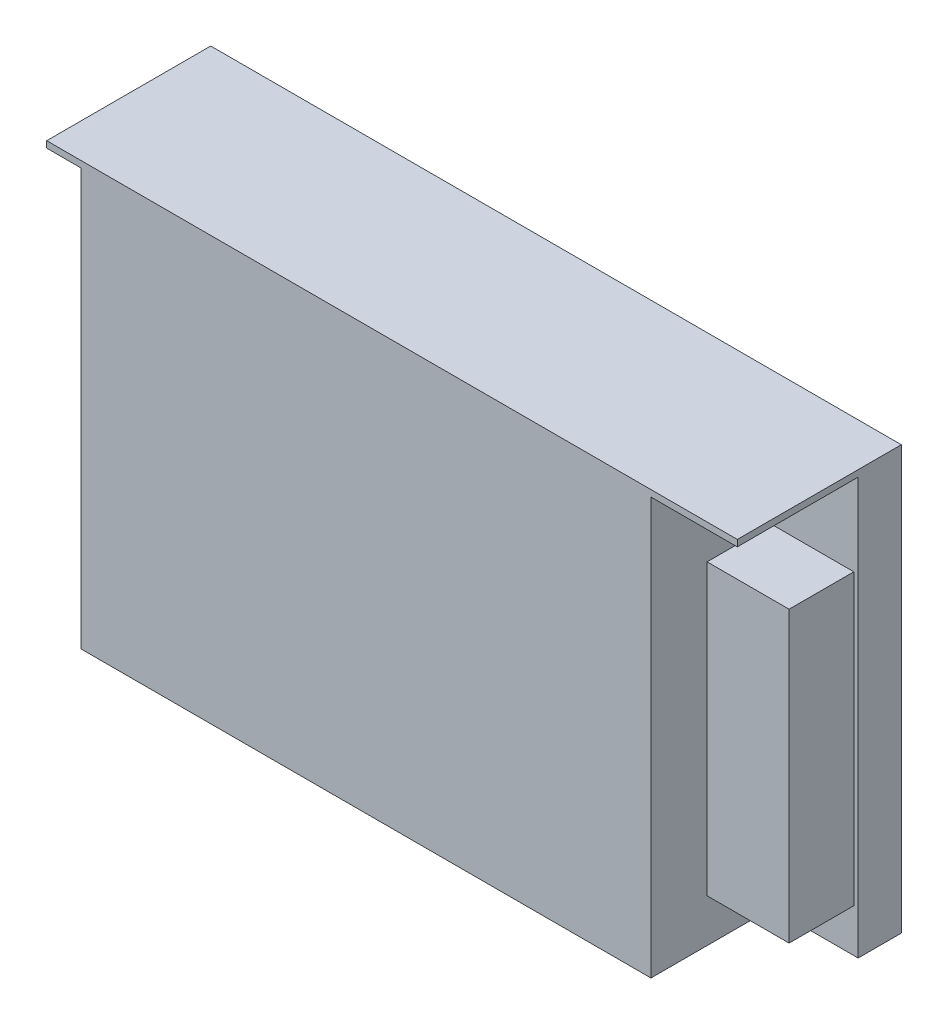
ISO-10303-21;
HEADER;
FILE_DESCRIPTION(('STEP AP214'),'2;1');
FILE_NAME('part.step','',(''),(''),'','','');
FILE_SCHEMA(('AUTOMOTIVE_DESIGN { 1 0 10303 214 1 1 1 1 }'));
ENDSEC;
DATA;
#1=APPLICATION_CONTEXT('core data for automotive mechanical design processes');
#2=APPLICATION_PROTOCOL_DEFINITION('international standard','automotive_design',2000,#1);
#3=PRODUCT_CONTEXT('',#1,'mechanical');
#4=PRODUCT('Part','Part','',(#3));
#5=PRODUCT_RELATED_PRODUCT_CATEGORY('part','',(#4));
#6=PRODUCT_DEFINITION_FORMATION('','',#4);
#7=PRODUCT_DEFINITION_CONTEXT('part definition',#1,'design');
#8=PRODUCT_DEFINITION('design','',#6,#7);
#9=PRODUCT_DEFINITION_SHAPE('','',#8);
#10=(LENGTH_UNIT() NAMED_UNIT(*) SI_UNIT(.MILLI.,.METRE.));
#11=(NAMED_UNIT(*) PLANE_ANGLE_UNIT() SI_UNIT($,.RADIAN.));
#12=(NAMED_UNIT(*) SI_UNIT($,.STERADIAN.) SOLID_ANGLE_UNIT());
#13=UNCERTAINTY_MEASURE_WITH_UNIT(LENGTH_MEASURE(1.E-05),#10,'distance_accuracy_value','');
#14=(GEOMETRIC_REPRESENTATION_CONTEXT(3) GLOBAL_UNCERTAINTY_ASSIGNED_CONTEXT((#13)) GLOBAL_UNIT_ASSIGNED_CONTEXT((#10,
#11,#12)) REPRESENTATION_CONTEXT('',''));
#15=CARTESIAN_POINT('',(0.,0.,0.));
#16=DIRECTION('',(0.,0.,1.));
#17=DIRECTION('',(1.,0.,0.));
#18=AXIS2_PLACEMENT_3D('',#15,#16,#17);
#19=CARTESIAN_POINT('',(8.,0.,30.0000000000001));
#20=DIRECTION('',(0.70710678118655,0.,-0.707106781186545));
#21=DIRECTION('',(0.,-1.,0.));
#22=AXIS2_PLACEMENT_3D('',#19,#20,#21);
#23=PLANE('',#22);
#24=DIRECTION('',(-0.707106781186545,0.,-0.70710678118655));
#25=VECTOR('',#24,1.);
#26=CARTESIAN_POINT('',(0.,10.,22.));
#27=LINE('',#26,#25);
#28=CARTESIAN_POINT('',(8.,10.,30.0000000000001));
#29=VERTEX_POINT('',#28);
#30=CARTESIAN_POINT('',(0.,10.,22.));
#31=VERTEX_POINT('',#30);
#32=EDGE_CURVE('E159',#29,#31,#27,.T.);
#33=ORIENTED_EDGE('',*,*,#32,.F.);
#34=DIRECTION('',(0.,-1.,0.));
#35=VECTOR('',#34,1.);
#36=CARTESIAN_POINT('',(8.,0.,30.0000000000001));
#37=LINE('',#36,#35);
#38=CARTESIAN_POINT('',(8.,96.5,30.0000000000001));
#39=VERTEX_POINT('',#38);
#40=EDGE_CURVE('E44',#39,#29,#37,.T.);
#41=ORIENTED_EDGE('',*,*,#40,.F.);
#42=DIRECTION('',(0.707106781186545,0.,0.70710678118655));
#43=VECTOR('',#42,1.);
#44=CARTESIAN_POINT('',(8.,96.5,30.0000000000001));
#45=LINE('',#44,#43);
#46=CARTESIAN_POINT('',(0.,96.5,22.));
#47=VERTEX_POINT('',#46);
#48=EDGE_CURVE('E11',#47,#39,#45,.T.);
#49=ORIENTED_EDGE('',*,*,#48,.F.);
#50=DIRECTION('',(0.,-1.,0.));
#51=VECTOR('',#50,1.);
#52=CARTESIAN_POINT('',(0.,0.,22.));
#53=LINE('',#52,#51);
#54=EDGE_CURVE('E179',#47,#31,#53,.T.);
#55=ORIENTED_EDGE('',*,*,#54,.T.);
#56=EDGE_LOOP('',(#33,#41,#49,#55));
#57=FACE_BOUND('',#56,.T.);
#58=ADVANCED_FACE('F37',(#57),#23,.F.);
#59=CARTESIAN_POINT('',(140.,96.5,10.));
#60=DIRECTION('',(-1.,0.,0.));
#61=DIRECTION('',(0.,0.,1.));
#62=AXIS2_PLACEMENT_3D('',#59,#60,#61);
#63=PLANE('',#62);
#64=DIRECTION('',(0.,0.,-1.));
#65=VECTOR('',#64,1.);
#66=CARTESIAN_POINT('',(140.,9.99999999999999,25.));
#67=LINE('',#66,#65);
#68=CARTESIAN_POINT('',(140.,9.99999999999999,25.));
#69=VERTEX_POINT('',#68);
#70=CARTESIAN_POINT('',(140.,9.99999999999999,10.));
#71=VERTEX_POINT('',#70);
#72=EDGE_CURVE('E215',#69,#71,#67,.T.);
#73=ORIENTED_EDGE('',*,*,#72,.F.);
#74=DIRECTION('',(0.,-1.,0.));
#75=VECTOR('',#74,1.);
#76=CARTESIAN_POINT('',(140.,9.99999999999999,25.));
#77=LINE('',#76,#75);
#78=CARTESIAN_POINT('',(140.,77.,25.));
#79=VERTEX_POINT('',#78);
#80=EDGE_CURVE('E188',#79,#69,#77,.T.);
#81=ORIENTED_EDGE('',*,*,#80,.F.);
#82=DIRECTION('',(0.,0.,-1.));
#83=VECTOR('',#82,1.);
#84=CARTESIAN_POINT('',(140.,77.,25.));
#85=LINE('',#84,#83);
#86=CARTESIAN_POINT('',(140.,77.,10.));
#87=VERTEX_POINT('',#86);
#88=EDGE_CURVE('E199',#79,#87,#85,.T.);
#89=ORIENTED_EDGE('',*,*,#88,.T.);
#90=DIRECTION('',(0.,-1.,0.));
#91=VECTOR('',#90,1.);
#92=CARTESIAN_POINT('',(140.,96.5,10.));
#93=LINE('',#92,#91);
#94=CARTESIAN_POINT('',(140.,96.5,10.));
#95=VERTEX_POINT('',#94);
#96=EDGE_CURVE('E227',#95,#87,#93,.T.);
#97=ORIENTED_EDGE('',*,*,#96,.F.);
#98=DIRECTION('',(0.,0.,1.));
#99=VECTOR('',#98,1.);
#100=CARTESIAN_POINT('',(140.,96.5,10.));
#101=LINE('',#100,#99);
#102=CARTESIAN_POINT('',(140.,96.5,38.));
#103=VERTEX_POINT('',#102);
#104=EDGE_CURVE('E240',#95,#103,#101,.T.);
#105=ORIENTED_EDGE('',*,*,#104,.T.);
#106=DIRECTION('',(0.,-1.,0.));
#107=VECTOR('',#106,1.);
#108=CARTESIAN_POINT('',(140.,96.5,38.));
#109=LINE('',#108,#107);
#110=CARTESIAN_POINT('',(140.,0.,38.));
#111=VERTEX_POINT('',#110);
#112=EDGE_CURVE('E223',#103,#111,#109,.T.);
#113=ORIENTED_EDGE('',*,*,#112,.T.);
#114=DIRECTION('',(0.,0.,1.));
#115=VECTOR('',#114,1.);
#116=CARTESIAN_POINT('',(140.,0.,10.));
#117=LINE('',#116,#115);
#118=CARTESIAN_POINT('',(140.,0.,10.));
#119=VERTEX_POINT('',#118);
#120=EDGE_CURVE('E236',#119,#111,#117,.T.);
#121=ORIENTED_EDGE('',*,*,#120,.F.);
#122=EDGE_CURVE('E226',#71,#119,#93,.T.);
#123=ORIENTED_EDGE('',*,*,#122,.F.);
#124=EDGE_LOOP('',(#73,#81,#89,#97,#105,#113,#121,#123));
#125=FACE_BOUND('',#124,.T.);
#126=ADVANCED_FACE('F301',(#125),#63,.F.);
#127=CARTESIAN_POINT('',(0.,0.,10.));
#128=DIRECTION('',(0.,0.,-1.));
#129=DIRECTION('',(-1.,0.,0.));
#130=AXIS2_PLACEMENT_3D('',#127,#128,#129);
#131=PLANE('',#130);
#132=DIRECTION('',(1.,0.,0.));
#133=VECTOR('',#132,1.);
#134=CARTESIAN_POINT('',(140.,9.99999999999999,10.));
#135=LINE('',#134,#133);
#136=CARTESIAN_POINT('',(159.,10.,10.));
#137=VERTEX_POINT('',#136);
#138=EDGE_CURVE('E187',#71,#137,#135,.T.);
#139=ORIENTED_EDGE('',*,*,#138,.F.);
#140=ORIENTED_EDGE('',*,*,#122,.T.);
#141=DIRECTION('',(1.,0.,0.));
#142=VECTOR('',#141,1.);
#143=CARTESIAN_POINT('',(160.,0.,10.));
#144=LINE('',#143,#142);
#145=CARTESIAN_POINT('',(160.,0.,10.));
#146=VERTEX_POINT('',#145);
#147=EDGE_CURVE('E229',#119,#146,#144,.T.);
#148=ORIENTED_EDGE('',*,*,#147,.T.);
#149=DIRECTION('',(0.,1.,0.));
#150=VECTOR('',#149,1.);
#151=CARTESIAN_POINT('',(160.,96.5,10.));
#152=LINE('',#151,#150);
#153=CARTESIAN_POINT('',(160.,96.5,10.));
#154=VERTEX_POINT('',#153);
#155=EDGE_CURVE('E219',#146,#154,#152,.T.);
#156=ORIENTED_EDGE('',*,*,#155,.T.);
#157=DIRECTION('',(-1.,0.,0.));
#158=VECTOR('',#157,1.);
#159=CARTESIAN_POINT('',(160.,96.5,10.));
#160=LINE('',#159,#158);
#161=EDGE_CURVE('E222',#154,#95,#160,.T.);
#162=ORIENTED_EDGE('',*,*,#161,.T.);
#163=ORIENTED_EDGE('',*,*,#96,.T.);
#164=DIRECTION('',(-1.,0.,0.));
#165=VECTOR('',#164,1.);
#166=CARTESIAN_POINT('',(140.,77.,10.));
#167=LINE('',#166,#165);
#168=CARTESIAN_POINT('',(159.,77.,10.));
#169=VERTEX_POINT('',#168);
#170=EDGE_CURVE('E192',#169,#87,#167,.T.);
#171=ORIENTED_EDGE('',*,*,#170,.F.);
#172=DIRECTION('',(0.,1.,0.));
#173=VECTOR('',#172,1.);
#174=CARTESIAN_POINT('',(159.,10.,10.));
#175=LINE('',#174,#173);
#176=EDGE_CURVE('E202',#137,#169,#175,.T.);
#177=ORIENTED_EDGE('',*,*,#176,.F.);
#178=EDGE_LOOP('',(#139,#140,#148,#156,#162,#163,#171,#177));
#179=FACE_BOUND('',#178,.T.);
#180=ADVANCED_FACE('F306',(#179),#131,.F.);
#181=CARTESIAN_POINT('',(0.,0.,38.));
#182=DIRECTION('',(1.,0.,0.));
#183=DIRECTION('',(0.,0.,-1.));
#184=AXIS2_PLACEMENT_3D('',#181,#182,#183);
#185=PLANE('',#184);
#186=DIRECTION('',(0.,0.,-1.));
#187=VECTOR('',#186,1.);
#188=CARTESIAN_POINT('',(0.,0.,38.));
#189=LINE('',#188,#187);
#190=CARTESIAN_POINT('',(0.,0.,1.5));
#191=VERTEX_POINT('',#190);
#192=CARTESIAN_POINT('',(0.,0.,0.));
#193=VERTEX_POINT('',#192);
#194=EDGE_CURVE('E168',#191,#193,#189,.T.);
#195=ORIENTED_EDGE('',*,*,#194,.F.);
#196=DIRECTION('',(0.,-1.,0.));
#197=VECTOR('',#196,1.);
#198=CARTESIAN_POINT('',(0.,10.,1.5));
#199=LINE('',#198,#197);
#200=CARTESIAN_POINT('',(0.,10.,1.5));
#201=VERTEX_POINT('',#200);
#202=EDGE_CURVE('E151',#201,#191,#199,.T.);
#203=ORIENTED_EDGE('',*,*,#202,.F.);
#204=DIRECTION('',(0.,0.,-1.));
#205=VECTOR('',#204,1.);
#206=CARTESIAN_POINT('',(0.,10.,1.5));
#207=LINE('',#206,#205);
#208=EDGE_CURVE('E155',#31,#201,#207,.T.);
#209=ORIENTED_EDGE('',*,*,#208,.F.);
#210=ORIENTED_EDGE('',*,*,#54,.F.);
#211=DIRECTION('',(0.,0.,-1.));
#212=VECTOR('',#211,1.);
#213=CARTESIAN_POINT('',(0.,96.5,38.));
#214=LINE('',#213,#212);
#215=CARTESIAN_POINT('',(0.,96.5,38.));
#216=VERTEX_POINT('',#215);
#217=EDGE_CURVE('E170',#216,#47,#214,.T.);
#218=ORIENTED_EDGE('',*,*,#217,.F.);
#219=DIRECTION('',(0.,-1.,0.));
#220=VECTOR('',#219,1.);
#221=CARTESIAN_POINT('',(0.,0.,38.));
#222=LINE('',#221,#220);
#223=CARTESIAN_POINT('',(0.,98.,38.));
#224=VERTEX_POINT('',#223);
#225=EDGE_CURVE('E243',#224,#216,#222,.T.);
#226=ORIENTED_EDGE('',*,*,#225,.F.);
#227=DIRECTION('',(0.,0.,-1.));
#228=VECTOR('',#227,1.);
#229=CARTESIAN_POINT('',(0.,98.,38.));
#230=LINE('',#229,#228);
#231=CARTESIAN_POINT('',(0.,98.,0.));
#232=VERTEX_POINT('',#231);
#233=EDGE_CURVE('E253',#224,#232,#230,.T.);
#234=ORIENTED_EDGE('',*,*,#233,.T.);
#235=DIRECTION('',(0.,-1.,0.));
#236=VECTOR('',#235,1.);
#237=CARTESIAN_POINT('',(0.,0.,0.));
#238=LINE('',#237,#236);
#239=EDGE_CURVE('E239',#232,#193,#238,.T.);
#240=ORIENTED_EDGE('',*,*,#239,.T.);
#241=EDGE_LOOP('',(#195,#203,#209,#210,#218,#226,#234,#240));
#242=FACE_BOUND('',#241,.T.);
#243=ADVANCED_FACE('F166',(#242),#185,.F.);
#244=CARTESIAN_POINT('',(0.,0.,38.));
#245=DIRECTION('',(0.,1.,0.));
#246=DIRECTION('',(0.,0.,1.));
#247=AXIS2_PLACEMENT_3D('',#244,#245,#246);
#248=PLANE('',#247);
#249=DIRECTION('',(0.,0.,1.));
#250=VECTOR('',#249,1.);
#251=CARTESIAN_POINT('',(8.,0.,38.));
#252=LINE('',#251,#250);
#253=CARTESIAN_POINT('',(8.,0.,1.5));
#254=VERTEX_POINT('',#253);
#255=CARTESIAN_POINT('',(8.,0.,38.));
#256=VERTEX_POINT('',#255);
#257=EDGE_CURVE('E181',#254,#256,#252,.T.);
#258=ORIENTED_EDGE('',*,*,#257,.F.);
#259=DIRECTION('',(1.,0.,0.));
#260=VECTOR('',#259,1.);
#261=CARTESIAN_POINT('',(8.,0.,1.5));
#262=LINE('',#261,#260);
#263=EDGE_CURVE('E163',#191,#254,#262,.T.);
#264=ORIENTED_EDGE('',*,*,#263,.F.);
#265=ORIENTED_EDGE('',*,*,#194,.T.);
#266=DIRECTION('',(1.,0.,0.));
#267=VECTOR('',#266,1.);
#268=CARTESIAN_POINT('',(0.,0.,0.));
#269=LINE('',#268,#267);
#270=CARTESIAN_POINT('',(160.,0.,0.));
#271=VERTEX_POINT('',#270);
#272=EDGE_CURVE('E255',#193,#271,#269,.T.);
#273=ORIENTED_EDGE('',*,*,#272,.T.);
#274=DIRECTION('',(0.,0.,-1.));
#275=VECTOR('',#274,1.);
#276=CARTESIAN_POINT('',(160.,0.,38.));
#277=LINE('',#276,#275);
#278=EDGE_CURVE('E266',#146,#271,#277,.T.);
#279=ORIENTED_EDGE('',*,*,#278,.F.);
#280=ORIENTED_EDGE('',*,*,#147,.F.);
#281=ORIENTED_EDGE('',*,*,#120,.T.);
#282=DIRECTION('',(1.,0.,0.));
#283=VECTOR('',#282,1.);
#284=CARTESIAN_POINT('',(0.,0.,38.));
#285=LINE('',#284,#283);
#286=EDGE_CURVE('E246',#256,#111,#285,.T.);
#287=ORIENTED_EDGE('',*,*,#286,.F.);
#288=EDGE_LOOP('',(#258,#264,#265,#273,#279,#280,#281,#287));
#289=FACE_BOUND('',#288,.T.);
#290=ADVANCED_FACE('F294',(#289),#248,.F.);
#291=CARTESIAN_POINT('',(160.,0.,38.));
#292=DIRECTION('',(-1.,0.,0.));
#293=DIRECTION('',(0.,0.,1.));
#294=AXIS2_PLACEMENT_3D('',#291,#292,#293);
#295=PLANE('',#294);
#296=DIRECTION('',(0.,1.,0.));
#297=VECTOR('',#296,1.);
#298=CARTESIAN_POINT('',(160.,0.,38.));
#299=LINE('',#298,#297);
#300=CARTESIAN_POINT('',(160.,96.5,38.));
#301=VERTEX_POINT('',#300);
#302=CARTESIAN_POINT('',(160.,98.,38.));
#303=VERTEX_POINT('',#302);
#304=EDGE_CURVE('E249',#301,#303,#299,.T.);
#305=ORIENTED_EDGE('',*,*,#304,.F.);
#306=DIRECTION('',(0.,0.,1.));
#307=VECTOR('',#306,1.);
#308=CARTESIAN_POINT('',(160.,96.5,10.));
#309=LINE('',#308,#307);
#310=EDGE_CURVE('E231',#154,#301,#309,.T.);
#311=ORIENTED_EDGE('',*,*,#310,.F.);
#312=ORIENTED_EDGE('',*,*,#155,.F.);
#313=ORIENTED_EDGE('',*,*,#278,.T.);
#314=DIRECTION('',(0.,1.,0.));
#315=VECTOR('',#314,1.);
#316=CARTESIAN_POINT('',(160.,0.,0.));
#317=LINE('',#316,#315);
#318=CARTESIAN_POINT('',(160.,98.,0.));
#319=VERTEX_POINT('',#318);
#320=EDGE_CURVE('E258',#271,#319,#317,.T.);
#321=ORIENTED_EDGE('',*,*,#320,.T.);
#322=DIRECTION('',(0.,0.,-1.));
#323=VECTOR('',#322,1.);
#324=CARTESIAN_POINT('',(160.,98.,38.));
#325=LINE('',#324,#323);
#326=EDGE_CURVE('E263',#303,#319,#325,.T.);
#327=ORIENTED_EDGE('',*,*,#326,.F.);
#328=EDGE_LOOP('',(#305,#311,#312,#313,#321,#327));
#329=FACE_BOUND('',#328,.T.);
#330=ADVANCED_FACE('F309',(#329),#295,.F.);
#331=CARTESIAN_POINT('',(0.,98.,38.));
#332=DIRECTION('',(0.,-1.,0.));
#333=DIRECTION('',(0.,0.,-1.));
#334=AXIS2_PLACEMENT_3D('',#331,#332,#333);
#335=PLANE('',#334);
#336=DIRECTION('',(-1.,0.,0.));
#337=VECTOR('',#336,1.);
#338=CARTESIAN_POINT('',(0.,98.,0.));
#339=LINE('',#338,#337);
#340=EDGE_CURVE('E247',#319,#232,#339,.T.);
#341=ORIENTED_EDGE('',*,*,#340,.T.);
#342=ORIENTED_EDGE('',*,*,#233,.F.);
#343=DIRECTION('',(-1.,0.,0.));
#344=VECTOR('',#343,1.);
#345=CARTESIAN_POINT('',(0.,98.,38.));
#346=LINE('',#345,#344);
#347=EDGE_CURVE('E251',#303,#224,#346,.T.);
#348=ORIENTED_EDGE('',*,*,#347,.F.);
#349=ORIENTED_EDGE('',*,*,#326,.T.);
#350=EDGE_LOOP('',(#341,#342,#348,#349));
#351=FACE_BOUND('',#350,.T.);
#352=ADVANCED_FACE('F285',(#351),#335,.F.);
#353=CARTESIAN_POINT('',(0.,0.,38.));
#354=DIRECTION('',(0.,0.,-1.));
#355=DIRECTION('',(-1.,0.,0.));
#356=AXIS2_PLACEMENT_3D('',#353,#354,#355);
#357=PLANE('',#356);
#358=ORIENTED_EDGE('',*,*,#225,.T.);
#359=DIRECTION('',(-1.,0.,0.));
#360=VECTOR('',#359,1.);
#361=CARTESIAN_POINT('',(8.,96.5,38.));
#362=LINE('',#361,#360);
#363=CARTESIAN_POINT('',(8.,96.5,38.));
#364=VERTEX_POINT('',#363);
#365=EDGE_CURVE('E183',#364,#216,#362,.T.);
#366=ORIENTED_EDGE('',*,*,#365,.F.);
#367=DIRECTION('',(0.,1.,0.));
#368=VECTOR('',#367,1.);
#369=CARTESIAN_POINT('',(8.,0.,38.));
#370=LINE('',#369,#368);
#371=EDGE_CURVE('E175',#256,#364,#370,.T.);
#372=ORIENTED_EDGE('',*,*,#371,.F.);
#373=ORIENTED_EDGE('',*,*,#286,.T.);
#374=ORIENTED_EDGE('',*,*,#112,.F.);
#375=DIRECTION('',(-1.,0.,0.));
#376=VECTOR('',#375,1.);
#377=CARTESIAN_POINT('',(160.,96.5,38.));
#378=LINE('',#377,#376);
#379=EDGE_CURVE('E218',#301,#103,#378,.T.);
#380=ORIENTED_EDGE('',*,*,#379,.F.);
#381=ORIENTED_EDGE('',*,*,#304,.T.);
#382=ORIENTED_EDGE('',*,*,#347,.T.);
#383=EDGE_LOOP('',(#358,#366,#372,#373,#374,#380,#381,#382));
#384=FACE_BOUND('',#383,.T.);
#385=ADVANCED_FACE('F277',(#384),#357,.F.);
#386=CARTESIAN_POINT('',(0.,0.,0.));
#387=DIRECTION('',(0.,0.,-1.));
#388=DIRECTION('',(-1.,0.,0.));
#389=AXIS2_PLACEMENT_3D('',#386,#387,#388);
#390=PLANE('',#389);
#391=ORIENTED_EDGE('',*,*,#239,.F.);
#392=ORIENTED_EDGE('',*,*,#340,.F.);
#393=ORIENTED_EDGE('',*,*,#320,.F.);
#394=ORIENTED_EDGE('',*,*,#272,.F.);
#395=EDGE_LOOP('',(#391,#392,#393,#394));
#396=FACE_BOUND('',#395,.T.);
#397=ADVANCED_FACE('F290',(#396),#390,.T.);
#398=CARTESIAN_POINT('',(160.,96.5,10.));
#399=DIRECTION('',(0.,1.,0.));
#400=DIRECTION('',(0.,0.,1.));
#401=AXIS2_PLACEMENT_3D('',#398,#399,#400);
#402=PLANE('',#401);
#403=ORIENTED_EDGE('',*,*,#379,.T.);
#404=ORIENTED_EDGE('',*,*,#104,.F.);
#405=ORIENTED_EDGE('',*,*,#161,.F.);
#406=ORIENTED_EDGE('',*,*,#310,.T.);
#407=EDGE_LOOP('',(#403,#404,#405,#406));
#408=FACE_BOUND('',#407,.T.);
#409=ADVANCED_FACE('F311',(#408),#402,.F.);
#410=CARTESIAN_POINT('',(140.,9.99999999999999,25.));
#411=DIRECTION('',(0.,1.,0.));
#412=DIRECTION('',(-1.,0.,0.));
#413=AXIS2_PLACEMENT_3D('',#410,#411,#412);
#414=PLANE('',#413);
#415=ORIENTED_EDGE('',*,*,#138,.T.);
#416=DIRECTION('',(0.,0.,-1.));
#417=VECTOR('',#416,1.);
#418=CARTESIAN_POINT('',(159.,10.,25.));
#419=LINE('',#418,#417);
#420=CARTESIAN_POINT('',(159.,10.,25.));
#421=VERTEX_POINT('',#420);
#422=EDGE_CURVE('E212',#421,#137,#419,.T.);
#423=ORIENTED_EDGE('',*,*,#422,.F.);
#424=DIRECTION('',(1.,0.,0.));
#425=VECTOR('',#424,1.);
#426=CARTESIAN_POINT('',(140.,9.99999999999999,25.));
#427=LINE('',#426,#425);
#428=EDGE_CURVE('E191',#69,#421,#427,.T.);
#429=ORIENTED_EDGE('',*,*,#428,.F.);
#430=ORIENTED_EDGE('',*,*,#72,.T.);
#431=EDGE_LOOP('',(#415,#423,#429,#430));
#432=FACE_BOUND('',#431,.T.);
#433=ADVANCED_FACE('F322',(#432),#414,.F.);
#434=CARTESIAN_POINT('',(159.,10.,25.));
#435=DIRECTION('',(-1.,0.,0.));
#436=DIRECTION('',(0.,0.,1.));
#437=AXIS2_PLACEMENT_3D('',#434,#435,#436);
#438=PLANE('',#437);
#439=ORIENTED_EDGE('',*,*,#176,.T.);
#440=DIRECTION('',(0.,0.,-1.));
#441=VECTOR('',#440,1.);
#442=CARTESIAN_POINT('',(159.,77.,25.));
#443=LINE('',#442,#441);
#444=CARTESIAN_POINT('',(159.,77.,25.));
#445=VERTEX_POINT('',#444);
#446=EDGE_CURVE('E209',#445,#169,#443,.T.);
#447=ORIENTED_EDGE('',*,*,#446,.F.);
#448=DIRECTION('',(0.,1.,0.));
#449=VECTOR('',#448,1.);
#450=CARTESIAN_POINT('',(159.,10.,25.));
#451=LINE('',#450,#449);
#452=EDGE_CURVE('E194',#421,#445,#451,.T.);
#453=ORIENTED_EDGE('',*,*,#452,.F.);
#454=ORIENTED_EDGE('',*,*,#422,.T.);
#455=EDGE_LOOP('',(#439,#447,#453,#454));
#456=FACE_BOUND('',#455,.T.);
#457=ADVANCED_FACE('F319',(#456),#438,.F.);
#458=CARTESIAN_POINT('',(140.,77.,25.));
#459=DIRECTION('',(0.,-1.,0.));
#460=DIRECTION('',(0.,0.,-1.));
#461=AXIS2_PLACEMENT_3D('',#458,#459,#460);
#462=PLANE('',#461);
#463=ORIENTED_EDGE('',*,*,#170,.T.);
#464=ORIENTED_EDGE('',*,*,#88,.F.);
#465=DIRECTION('',(-1.,0.,0.));
#466=VECTOR('',#465,1.);
#467=CARTESIAN_POINT('',(140.,77.,25.));
#468=LINE('',#467,#466);
#469=EDGE_CURVE('E196',#445,#79,#468,.T.);
#470=ORIENTED_EDGE('',*,*,#469,.F.);
#471=ORIENTED_EDGE('',*,*,#446,.T.);
#472=EDGE_LOOP('',(#463,#464,#470,#471));
#473=FACE_BOUND('',#472,.T.);
#474=ADVANCED_FACE('F315',(#473),#462,.F.);
#475=CARTESIAN_POINT('',(0.,0.,25.));
#476=DIRECTION('',(0.,0.,-1.));
#477=DIRECTION('',(-1.,0.,0.));
#478=AXIS2_PLACEMENT_3D('',#475,#476,#477);
#479=PLANE('',#478);
#480=ORIENTED_EDGE('',*,*,#80,.T.);
#481=ORIENTED_EDGE('',*,*,#428,.T.);
#482=ORIENTED_EDGE('',*,*,#452,.T.);
#483=ORIENTED_EDGE('',*,*,#469,.T.);
#484=EDGE_LOOP('',(#480,#481,#482,#483));
#485=FACE_BOUND('',#484,.T.);
#486=ADVANCED_FACE('F325',(#485),#479,.F.);
#487=CARTESIAN_POINT('',(8.,96.5,38.));
#488=DIRECTION('',(0.,1.,0.));
#489=DIRECTION('',(0.,0.,1.));
#490=AXIS2_PLACEMENT_3D('',#487,#488,#489);
#491=PLANE('',#490);
#492=ORIENTED_EDGE('',*,*,#217,.T.);
#493=ORIENTED_EDGE('',*,*,#48,.T.);
#494=DIRECTION('',(0.,0.,-1.));
#495=VECTOR('',#494,1.);
#496=CARTESIAN_POINT('',(8.,96.5,38.));
#497=LINE('',#496,#495);
#498=EDGE_CURVE('E178',#364,#39,#497,.T.);
#499=ORIENTED_EDGE('',*,*,#498,.F.);
#500=ORIENTED_EDGE('',*,*,#365,.T.);
#501=EDGE_LOOP('',(#492,#493,#499,#500));
#502=FACE_BOUND('',#501,.T.);
#503=ADVANCED_FACE('F327',(#502),#491,.F.);
#504=CARTESIAN_POINT('',(8.,0.,0.));
#505=DIRECTION('',(-1.,0.,0.));
#506=DIRECTION('',(0.,0.,1.));
#507=AXIS2_PLACEMENT_3D('',#504,#505,#506);
#508=PLANE('',#507);
#509=ORIENTED_EDGE('',*,*,#498,.T.);
#510=ORIENTED_EDGE('',*,*,#40,.T.);
#511=DIRECTION('',(0.,0.,1.));
#512=VECTOR('',#511,1.);
#513=CARTESIAN_POINT('',(8.,10.,30.0000000000001));
#514=LINE('',#513,#512);
#515=CARTESIAN_POINT('',(8.,10.,1.5));
#516=VERTEX_POINT('',#515);
#517=EDGE_CURVE('E51',#516,#29,#514,.T.);
#518=ORIENTED_EDGE('',*,*,#517,.F.);
#519=DIRECTION('',(0.,-1.,0.));
#520=VECTOR('',#519,1.);
#521=CARTESIAN_POINT('',(8.,10.,1.5));
#522=LINE('',#521,#520);
#523=EDGE_CURVE('E154',#516,#254,#522,.T.);
#524=ORIENTED_EDGE('',*,*,#523,.T.);
#525=ORIENTED_EDGE('',*,*,#257,.T.);
#526=ORIENTED_EDGE('',*,*,#371,.T.);
#527=EDGE_LOOP('',(#509,#510,#518,#524,#525,#526));
#528=FACE_BOUND('',#527,.T.);
#529=ADVANCED_FACE('F271',(#528),#508,.T.);
#530=CARTESIAN_POINT('',(8.,10.,1.5));
#531=DIRECTION('',(0.,0.,-1.));
#532=DIRECTION('',(-1.,0.,0.));
#533=AXIS2_PLACEMENT_3D('',#530,#531,#532);
#534=PLANE('',#533);
#535=ORIENTED_EDGE('',*,*,#263,.T.);
#536=ORIENTED_EDGE('',*,*,#523,.F.);
#537=DIRECTION('',(1.,0.,0.));
#538=VECTOR('',#537,1.);
#539=CARTESIAN_POINT('',(8.,10.,1.5));
#540=LINE('',#539,#538);
#541=EDGE_CURVE('E146',#201,#516,#540,.T.);
#542=ORIENTED_EDGE('',*,*,#541,.F.);
#543=ORIENTED_EDGE('',*,*,#202,.T.);
#544=EDGE_LOOP('',(#535,#536,#542,#543));
#545=FACE_BOUND('',#544,.T.);
#546=ADVANCED_FACE('F149',(#545),#534,.F.);
#547=CARTESIAN_POINT('',(0.,10.,0.));
#548=DIRECTION('',(0.,-1.,0.));
#549=DIRECTION('',(0.,0.,-1.));
#550=AXIS2_PLACEMENT_3D('',#547,#548,#549);
#551=PLANE('',#550);
#552=ORIENTED_EDGE('',*,*,#208,.T.);
#553=ORIENTED_EDGE('',*,*,#541,.T.);
#554=ORIENTED_EDGE('',*,*,#517,.T.);
#555=ORIENTED_EDGE('',*,*,#32,.T.);
#556=EDGE_LOOP('',(#552,#553,#554,#555));
#557=FACE_BOUND('',#556,.T.);
#558=ADVANCED_FACE('F158',(#557),#551,.T.);
#559=CLOSED_SHELL('',(#58,#126,#180,#243,#290,#330,#352,#385,#397,#409,#433,#457,#474,#486,#503,
#529,#546,#558));
#560=MANIFOLD_SOLID_BREP('B2',#559);
#561=ADVANCED_BREP_SHAPE_REPRESENTATION('',(#18,#560),#14);
#562=SHAPE_DEFINITION_REPRESENTATION(#9,#561);
ENDSEC;
END-ISO-10303-21;
